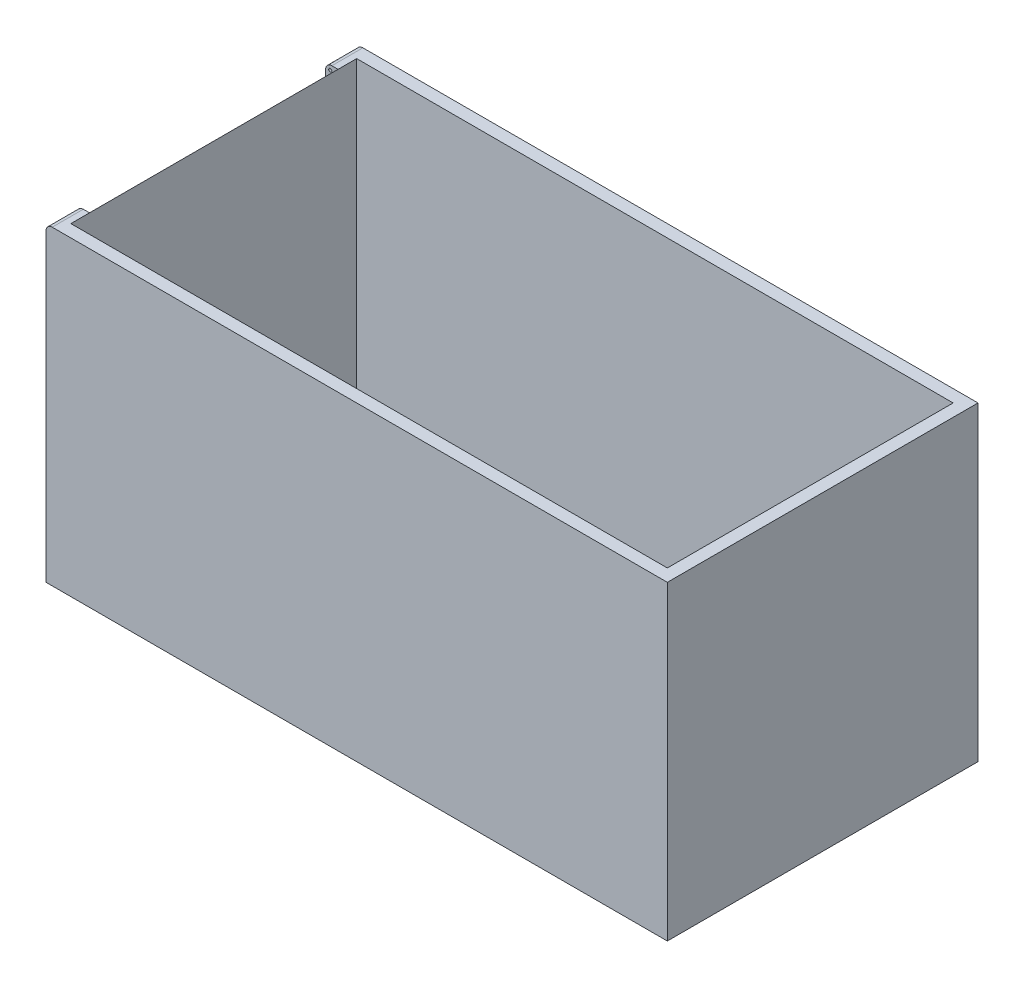
ISO-10303-21;
HEADER;
FILE_DESCRIPTION(('STEP AP214'),'2;1');
FILE_NAME('part.step','',(''),(''),'','','');
FILE_SCHEMA(('AUTOMOTIVE_DESIGN { 1 0 10303 214 1 1 1 1 }'));
ENDSEC;
DATA;
#1=APPLICATION_CONTEXT('core data for automotive mechanical design processes');
#2=APPLICATION_PROTOCOL_DEFINITION('international standard','automotive_design',2000,#1);
#3=PRODUCT_CONTEXT('',#1,'mechanical');
#4=PRODUCT('Part','Part','',(#3));
#5=PRODUCT_RELATED_PRODUCT_CATEGORY('part','',(#4));
#6=PRODUCT_DEFINITION_FORMATION('','',#4);
#7=PRODUCT_DEFINITION_CONTEXT('part definition',#1,'design');
#8=PRODUCT_DEFINITION('design','',#6,#7);
#9=PRODUCT_DEFINITION_SHAPE('','',#8);
#10=(LENGTH_UNIT() NAMED_UNIT(*) SI_UNIT(.MILLI.,.METRE.));
#11=(NAMED_UNIT(*) PLANE_ANGLE_UNIT() SI_UNIT($,.RADIAN.));
#12=(NAMED_UNIT(*) SI_UNIT($,.STERADIAN.) SOLID_ANGLE_UNIT());
#13=UNCERTAINTY_MEASURE_WITH_UNIT(LENGTH_MEASURE(1.E-05),#10,'distance_accuracy_value','');
#14=(GEOMETRIC_REPRESENTATION_CONTEXT(3) GLOBAL_UNCERTAINTY_ASSIGNED_CONTEXT((#13)) GLOBAL_UNIT_ASSIGNED_CONTEXT((#10,
#11,#12)) REPRESENTATION_CONTEXT('',''));
#15=CARTESIAN_POINT('',(0.,0.,0.));
#16=DIRECTION('',(0.,0.,1.));
#17=DIRECTION('',(1.,0.,0.));
#18=AXIS2_PLACEMENT_3D('',#15,#16,#17);
#19=CARTESIAN_POINT('',(0.,63.5,0.));
#20=DIRECTION('',(0.,-1.,0.));
#21=DIRECTION('',(0.,0.,-1.));
#22=AXIS2_PLACEMENT_3D('',#19,#20,#21);
#23=PLANE('',#22);
#24=DIRECTION('',(-1.,0.,0.));
#25=VECTOR('',#24,1.);
#26=CARTESIAN_POINT('',(-60.96,63.5,25.4));
#27=LINE('',#26,#25);
#28=CARTESIAN_POINT('',(-60.96,63.5,25.4));
#29=VERTEX_POINT('',#28);
#30=CARTESIAN_POINT('',(-62.23,63.5,25.4));
#31=VERTEX_POINT('',#30);
#32=EDGE_CURVE('E162',#29,#31,#27,.T.);
#33=ORIENTED_EDGE('',*,*,#32,.T.);
#34=DIRECTION('',(0.,0.,1.));
#35=VECTOR('',#34,1.);
#36=CARTESIAN_POINT('',(-62.23,63.5,0.));
#37=LINE('',#36,#35);
#38=CARTESIAN_POINT('',(-62.23,63.5,31.75));
#39=VERTEX_POINT('',#38);
#40=EDGE_CURVE('E253',#31,#39,#37,.T.);
#41=ORIENTED_EDGE('',*,*,#40,.T.);
#42=DIRECTION('',(1.,0.,0.));
#43=VECTOR('',#42,1.);
#44=CARTESIAN_POINT('',(-63.5,63.5,31.75));
#45=LINE('',#44,#43);
#46=CARTESIAN_POINT('',(63.5,63.5,31.75));
#47=VERTEX_POINT('',#46);
#48=EDGE_CURVE('E214',#39,#47,#45,.T.);
#49=ORIENTED_EDGE('',*,*,#48,.T.);
#50=DIRECTION('',(0.,0.,-1.));
#51=VECTOR('',#50,1.);
#52=CARTESIAN_POINT('',(63.5,63.5,31.75));
#53=LINE('',#52,#51);
#54=CARTESIAN_POINT('',(63.5,63.5,-31.75));
#55=VERTEX_POINT('',#54);
#56=EDGE_CURVE('E205',#47,#55,#53,.T.);
#57=ORIENTED_EDGE('',*,*,#56,.T.);
#58=DIRECTION('',(-1.,0.,0.));
#59=VECTOR('',#58,1.);
#60=CARTESIAN_POINT('',(-63.5,63.5,-31.75));
#61=LINE('',#60,#59);
#62=CARTESIAN_POINT('',(-62.23,63.5,-31.75));
#63=VERTEX_POINT('',#62);
#64=EDGE_CURVE('E209',#55,#63,#61,.T.);
#65=ORIENTED_EDGE('',*,*,#64,.T.);
#66=DIRECTION('',(0.,0.,1.));
#67=VECTOR('',#66,1.);
#68=CARTESIAN_POINT('',(-62.23,63.5,0.));
#69=LINE('',#68,#67);
#70=CARTESIAN_POINT('',(-62.23,63.5,-25.4));
#71=VERTEX_POINT('',#70);
#72=EDGE_CURVE('E244',#63,#71,#69,.T.);
#73=ORIENTED_EDGE('',*,*,#72,.T.);
#74=DIRECTION('',(-1.,0.,0.));
#75=VECTOR('',#74,1.);
#76=CARTESIAN_POINT('',(-60.96,63.5,-25.4));
#77=LINE('',#76,#75);
#78=CARTESIAN_POINT('',(-60.96,63.5,-25.4));
#79=VERTEX_POINT('',#78);
#80=EDGE_CURVE('E147',#79,#71,#77,.T.);
#81=ORIENTED_EDGE('',*,*,#80,.F.);
#82=DIRECTION('',(0.,0.,1.));
#83=VECTOR('',#82,1.);
#84=CARTESIAN_POINT('',(-60.96,63.5,0.));
#85=LINE('',#84,#83);
#86=CARTESIAN_POINT('',(-60.96,63.5,-29.21));
#87=VERTEX_POINT('',#86);
#88=EDGE_CURVE('E199',#87,#79,#85,.T.);
#89=ORIENTED_EDGE('',*,*,#88,.F.);
#90=DIRECTION('',(-1.,0.,0.));
#91=VECTOR('',#90,1.);
#92=CARTESIAN_POINT('',(0.,63.5,-29.21));
#93=LINE('',#92,#91);
#94=CARTESIAN_POINT('',(60.96,63.5,-29.21));
#95=VERTEX_POINT('',#94);
#96=EDGE_CURVE('E195',#95,#87,#93,.T.);
#97=ORIENTED_EDGE('',*,*,#96,.F.);
#98=DIRECTION('',(0.,0.,-1.));
#99=VECTOR('',#98,1.);
#100=CARTESIAN_POINT('',(60.96,63.5,0.));
#101=LINE('',#100,#99);
#102=CARTESIAN_POINT('',(60.96,63.5,29.21));
#103=VERTEX_POINT('',#102);
#104=EDGE_CURVE('E192',#103,#95,#101,.T.);
#105=ORIENTED_EDGE('',*,*,#104,.F.);
#106=DIRECTION('',(1.,0.,0.));
#107=VECTOR('',#106,1.);
#108=CARTESIAN_POINT('',(0.,63.5,29.21));
#109=LINE('',#108,#107);
#110=CARTESIAN_POINT('',(-60.96,63.5,29.21));
#111=VERTEX_POINT('',#110);
#112=EDGE_CURVE('E177',#111,#103,#109,.T.);
#113=ORIENTED_EDGE('',*,*,#112,.F.);
#114=EDGE_CURVE('E198',#29,#111,#85,.T.);
#115=ORIENTED_EDGE('',*,*,#114,.F.);
#116=EDGE_LOOP('',(#33,#41,#49,#57,#65,#73,#81,#89,#97,#105,#113,#115));
#117=FACE_BOUND('',#116,.T.);
#118=ADVANCED_FACE('F38',(#117),#23,.F.);
#119=CARTESIAN_POINT('',(63.5,63.5,31.75));
#120=DIRECTION('',(-1.,0.,0.));
#121=DIRECTION('',(0.,0.,1.));
#122=AXIS2_PLACEMENT_3D('',#119,#120,#121);
#123=PLANE('',#122);
#124=DIRECTION('',(0.,0.,-1.));
#125=VECTOR('',#124,1.);
#126=CARTESIAN_POINT('',(63.5,0.,31.75));
#127=LINE('',#126,#125);
#128=CARTESIAN_POINT('',(63.5,0.,31.75));
#129=VERTEX_POINT('',#128);
#130=CARTESIAN_POINT('',(63.5,0.,-31.75));
#131=VERTEX_POINT('',#130);
#132=EDGE_CURVE('E170',#129,#131,#127,.T.);
#133=ORIENTED_EDGE('',*,*,#132,.T.);
#134=DIRECTION('',(0.,-1.,0.));
#135=VECTOR('',#134,1.);
#136=CARTESIAN_POINT('',(63.5,63.5,-31.75));
#137=LINE('',#136,#135);
#138=EDGE_CURVE('E240',#55,#131,#137,.T.);
#139=ORIENTED_EDGE('',*,*,#138,.F.);
#140=ORIENTED_EDGE('',*,*,#56,.F.);
#141=DIRECTION('',(0.,-1.,0.));
#142=VECTOR('',#141,1.);
#143=CARTESIAN_POINT('',(63.5,63.5,31.75));
#144=LINE('',#143,#142);
#145=EDGE_CURVE('E217',#47,#129,#144,.T.);
#146=ORIENTED_EDGE('',*,*,#145,.T.);
#147=EDGE_LOOP('',(#133,#139,#140,#146));
#148=FACE_BOUND('',#147,.T.);
#149=ADVANCED_FACE('F319',(#148),#123,.F.);
#150=CARTESIAN_POINT('',(-63.5,63.5,-31.75));
#151=DIRECTION('',(0.,0.,1.));
#152=DIRECTION('',(1.,0.,0.));
#153=AXIS2_PLACEMENT_3D('',#150,#151,#152);
#154=PLANE('',#153);
#155=DIRECTION('',(0.,-1.,0.));
#156=VECTOR('',#155,1.);
#157=CARTESIAN_POINT('',(-63.5,63.5,-31.75));
#158=LINE('',#157,#156);
#159=CARTESIAN_POINT('',(-63.5,62.23,-31.75));
#160=VERTEX_POINT('',#159);
#161=CARTESIAN_POINT('',(-63.5,0.,-31.75));
#162=VERTEX_POINT('',#161);
#163=EDGE_CURVE('E237',#160,#162,#158,.T.);
#164=ORIENTED_EDGE('',*,*,#163,.F.);
#165=CARTESIAN_POINT('',(-62.23,62.23,-31.75));
#166=DIRECTION('',(0.,0.,1.));
#167=DIRECTION('',(1.,0.,0.));
#168=AXIS2_PLACEMENT_3D('',#165,#166,#167);
#169=CIRCLE('',#168,1.27);
#170=EDGE_CURVE('E11',#160,#63,#169,.F.);
#171=ORIENTED_EDGE('',*,*,#170,.T.);
#172=ORIENTED_EDGE('',*,*,#64,.F.);
#173=ORIENTED_EDGE('',*,*,#138,.T.);
#174=DIRECTION('',(-1.,0.,0.));
#175=VECTOR('',#174,1.);
#176=CARTESIAN_POINT('',(-63.5,0.,-31.75));
#177=LINE('',#176,#175);
#178=EDGE_CURVE('E221',#131,#162,#177,.T.);
#179=ORIENTED_EDGE('',*,*,#178,.T.);
#180=EDGE_LOOP('',(#164,#171,#172,#173,#179));
#181=FACE_BOUND('',#180,.T.);
#182=ADVANCED_FACE('F324',(#181),#154,.F.);
#183=CARTESIAN_POINT('',(-63.5,63.5,31.75));
#184=DIRECTION('',(1.,0.,0.));
#185=DIRECTION('',(0.,0.,-1.));
#186=AXIS2_PLACEMENT_3D('',#183,#184,#185);
#187=PLANE('',#186);
#188=DIRECTION('',(0.,-1.,0.));
#189=VECTOR('',#188,1.);
#190=CARTESIAN_POINT('',(-63.5,63.5,31.75));
#191=LINE('',#190,#189);
#192=CARTESIAN_POINT('',(-63.5,62.23,31.75));
#193=VERTEX_POINT('',#192);
#194=CARTESIAN_POINT('',(-63.5,0.,31.75));
#195=VERTEX_POINT('',#194);
#196=EDGE_CURVE('E234',#193,#195,#191,.T.);
#197=ORIENTED_EDGE('',*,*,#196,.F.);
#198=DIRECTION('',(0.,0.,1.));
#199=VECTOR('',#198,1.);
#200=CARTESIAN_POINT('',(-63.5,62.23,31.75));
#201=LINE('',#200,#199);
#202=CARTESIAN_POINT('',(-63.5,62.23,25.4));
#203=VERTEX_POINT('',#202);
#204=EDGE_CURVE('E262',#193,#203,#201,.F.);
#205=ORIENTED_EDGE('',*,*,#204,.T.);
#206=DIRECTION('',(0.,-1.,0.));
#207=VECTOR('',#206,1.);
#208=CARTESIAN_POINT('',(-63.5,63.5,25.4));
#209=LINE('',#208,#207);
#210=CARTESIAN_POINT('',(-63.5,60.96,25.4));
#211=VERTEX_POINT('',#210);
#212=EDGE_CURVE('E152',#203,#211,#209,.T.);
#213=ORIENTED_EDGE('',*,*,#212,.T.);
#214=DIRECTION('',(0.,0.,-1.));
#215=VECTOR('',#214,1.);
#216=CARTESIAN_POINT('',(-63.5,60.96,25.4));
#217=LINE('',#216,#215);
#218=CARTESIAN_POINT('',(-63.5,60.96,-25.4));
#219=VERTEX_POINT('',#218);
#220=EDGE_CURVE('E143',#211,#219,#217,.T.);
#221=ORIENTED_EDGE('',*,*,#220,.T.);
#222=DIRECTION('',(0.,-1.,0.));
#223=VECTOR('',#222,1.);
#224=CARTESIAN_POINT('',(-63.5,63.5,-25.4));
#225=LINE('',#224,#223);
#226=CARTESIAN_POINT('',(-63.5,62.23,-25.4));
#227=VERTEX_POINT('',#226);
#228=EDGE_CURVE('E130',#227,#219,#225,.T.);
#229=ORIENTED_EDGE('',*,*,#228,.F.);
#230=DIRECTION('',(0.,0.,1.));
#231=VECTOR('',#230,1.);
#232=CARTESIAN_POINT('',(-63.5,62.23,31.75));
#233=LINE('',#232,#231);
#234=EDGE_CURVE('E54',#227,#160,#233,.F.);
#235=ORIENTED_EDGE('',*,*,#234,.T.);
#236=ORIENTED_EDGE('',*,*,#163,.T.);
#237=DIRECTION('',(0.,0.,1.));
#238=VECTOR('',#237,1.);
#239=CARTESIAN_POINT('',(-63.5,0.,31.75));
#240=LINE('',#239,#238);
#241=EDGE_CURVE('E225',#162,#195,#240,.T.);
#242=ORIENTED_EDGE('',*,*,#241,.T.);
#243=EDGE_LOOP('',(#197,#205,#213,#221,#229,#235,#236,#242));
#244=FACE_BOUND('',#243,.T.);
#245=ADVANCED_FACE('F150',(#244),#187,.F.);
#246=CARTESIAN_POINT('',(-63.5,63.5,31.75));
#247=DIRECTION('',(0.,0.,-1.));
#248=DIRECTION('',(-1.,0.,0.));
#249=AXIS2_PLACEMENT_3D('',#246,#247,#248);
#250=PLANE('',#249);
#251=ORIENTED_EDGE('',*,*,#48,.F.);
#252=CARTESIAN_POINT('',(-62.23,62.23,31.75));
#253=DIRECTION('',(0.,0.,-1.));
#254=DIRECTION('',(-1.,0.,0.));
#255=AXIS2_PLACEMENT_3D('',#252,#253,#254);
#256=CIRCLE('',#255,1.27);
#257=EDGE_CURVE('E257',#39,#193,#256,.F.);
#258=ORIENTED_EDGE('',*,*,#257,.T.);
#259=ORIENTED_EDGE('',*,*,#196,.T.);
#260=DIRECTION('',(1.,0.,0.));
#261=VECTOR('',#260,1.);
#262=CARTESIAN_POINT('',(-63.5,0.,31.75));
#263=LINE('',#262,#261);
#264=EDGE_CURVE('E210',#195,#129,#263,.T.);
#265=ORIENTED_EDGE('',*,*,#264,.T.);
#266=ORIENTED_EDGE('',*,*,#145,.F.);
#267=EDGE_LOOP('',(#251,#258,#259,#265,#266));
#268=FACE_BOUND('',#267,.T.);
#269=ADVANCED_FACE('F310',(#268),#250,.F.);
#270=CARTESIAN_POINT('',(0.,0.,0.));
#271=DIRECTION('',(0.,-1.,0.));
#272=DIRECTION('',(0.,0.,-1.));
#273=AXIS2_PLACEMENT_3D('',#270,#271,#272);
#274=PLANE('',#273);
#275=ORIENTED_EDGE('',*,*,#132,.F.);
#276=ORIENTED_EDGE('',*,*,#264,.F.);
#277=ORIENTED_EDGE('',*,*,#241,.F.);
#278=ORIENTED_EDGE('',*,*,#178,.F.);
#279=EDGE_LOOP('',(#275,#276,#277,#278));
#280=FACE_BOUND('',#279,.T.);
#281=ADVANCED_FACE('F316',(#280),#274,.T.);
#282=CARTESIAN_POINT('',(60.96,63.5,31.75));
#283=DIRECTION('',(-1.,0.,0.));
#284=DIRECTION('',(0.,0.,1.));
#285=AXIS2_PLACEMENT_3D('',#282,#283,#284);
#286=PLANE('',#285);
#287=DIRECTION('',(0.,0.,-1.));
#288=VECTOR('',#287,1.);
#289=CARTESIAN_POINT('',(60.96,2.54,0.));
#290=LINE('',#289,#288);
#291=CARTESIAN_POINT('',(60.96,2.54,29.21));
#292=VERTEX_POINT('',#291);
#293=CARTESIAN_POINT('',(60.96,2.54,-29.21));
#294=VERTEX_POINT('',#293);
#295=EDGE_CURVE('E155',#292,#294,#290,.T.);
#296=ORIENTED_EDGE('',*,*,#295,.F.);
#297=DIRECTION('',(0.,-1.,0.));
#298=VECTOR('',#297,1.);
#299=CARTESIAN_POINT('',(60.96,63.5,29.21));
#300=LINE('',#299,#298);
#301=EDGE_CURVE('E172',#103,#292,#300,.T.);
#302=ORIENTED_EDGE('',*,*,#301,.F.);
#303=ORIENTED_EDGE('',*,*,#104,.T.);
#304=DIRECTION('',(0.,-1.,0.));
#305=VECTOR('',#304,1.);
#306=CARTESIAN_POINT('',(60.96,63.5,-29.21));
#307=LINE('',#306,#305);
#308=EDGE_CURVE('E166',#95,#294,#307,.T.);
#309=ORIENTED_EDGE('',*,*,#308,.T.);
#310=EDGE_LOOP('',(#296,#302,#303,#309));
#311=FACE_BOUND('',#310,.T.);
#312=ADVANCED_FACE('F287',(#311),#286,.T.);
#313=CARTESIAN_POINT('',(-63.5,63.5,-29.21));
#314=DIRECTION('',(0.,0.,1.));
#315=DIRECTION('',(1.,0.,0.));
#316=AXIS2_PLACEMENT_3D('',#313,#314,#315);
#317=PLANE('',#316);
#318=DIRECTION('',(-1.,0.,0.));
#319=VECTOR('',#318,1.);
#320=CARTESIAN_POINT('',(0.,2.54,-29.21));
#321=LINE('',#320,#319);
#322=CARTESIAN_POINT('',(-60.96,2.54,-29.21));
#323=VERTEX_POINT('',#322);
#324=EDGE_CURVE('E160',#294,#323,#321,.T.);
#325=ORIENTED_EDGE('',*,*,#324,.F.);
#326=ORIENTED_EDGE('',*,*,#308,.F.);
#327=ORIENTED_EDGE('',*,*,#96,.T.);
#328=DIRECTION('',(0.,-1.,0.));
#329=VECTOR('',#328,1.);
#330=CARTESIAN_POINT('',(-60.96,63.5,-29.21));
#331=LINE('',#330,#329);
#332=EDGE_CURVE('E171',#87,#323,#331,.T.);
#333=ORIENTED_EDGE('',*,*,#332,.T.);
#334=EDGE_LOOP('',(#325,#326,#327,#333));
#335=FACE_BOUND('',#334,.T.);
#336=ADVANCED_FACE('F289',(#335),#317,.T.);
#337=CARTESIAN_POINT('',(-60.96,63.5,31.75));
#338=DIRECTION('',(1.,0.,0.));
#339=DIRECTION('',(0.,0.,-1.));
#340=AXIS2_PLACEMENT_3D('',#337,#338,#339);
#341=PLANE('',#340);
#342=DIRECTION('',(0.,0.,1.));
#343=VECTOR('',#342,1.);
#344=CARTESIAN_POINT('',(-60.96,2.54,0.));
#345=LINE('',#344,#343);
#346=CARTESIAN_POINT('',(-60.96,2.54,29.21));
#347=VERTEX_POINT('',#346);
#348=EDGE_CURVE('E180',#323,#347,#345,.T.);
#349=ORIENTED_EDGE('',*,*,#348,.F.);
#350=ORIENTED_EDGE('',*,*,#332,.F.);
#351=ORIENTED_EDGE('',*,*,#88,.T.);
#352=DIRECTION('',(0.,0.,-1.));
#353=VECTOR('',#352,1.);
#354=CARTESIAN_POINT('',(-60.96,63.5,25.4));
#355=LINE('',#354,#353);
#356=EDGE_CURVE('E145',#29,#79,#355,.T.);
#357=ORIENTED_EDGE('',*,*,#356,.F.);
#358=ORIENTED_EDGE('',*,*,#114,.T.);
#359=DIRECTION('',(0.,-1.,0.));
#360=VECTOR('',#359,1.);
#361=CARTESIAN_POINT('',(-60.96,63.5,29.21));
#362=LINE('',#361,#360);
#363=EDGE_CURVE('E176',#111,#347,#362,.T.);
#364=ORIENTED_EDGE('',*,*,#363,.T.);
#365=EDGE_LOOP('',(#349,#350,#351,#357,#358,#364));
#366=FACE_BOUND('',#365,.T.);
#367=ADVANCED_FACE('F273',(#366),#341,.T.);
#368=CARTESIAN_POINT('',(-63.5,63.5,29.21));
#369=DIRECTION('',(0.,0.,-1.));
#370=DIRECTION('',(-1.,0.,0.));
#371=AXIS2_PLACEMENT_3D('',#368,#369,#370);
#372=PLANE('',#371);
#373=DIRECTION('',(1.,0.,0.));
#374=VECTOR('',#373,1.);
#375=CARTESIAN_POINT('',(0.,2.54,29.21));
#376=LINE('',#375,#374);
#377=EDGE_CURVE('E186',#347,#292,#376,.T.);
#378=ORIENTED_EDGE('',*,*,#377,.F.);
#379=ORIENTED_EDGE('',*,*,#363,.F.);
#380=ORIENTED_EDGE('',*,*,#112,.T.);
#381=ORIENTED_EDGE('',*,*,#301,.T.);
#382=EDGE_LOOP('',(#378,#379,#380,#381));
#383=FACE_BOUND('',#382,.T.);
#384=ADVANCED_FACE('F279',(#383),#372,.T.);
#385=CARTESIAN_POINT('',(0.,2.54,0.));
#386=DIRECTION('',(0.,-1.,0.));
#387=DIRECTION('',(0.,0.,-1.));
#388=AXIS2_PLACEMENT_3D('',#385,#386,#387);
#389=PLANE('',#388);
#390=ORIENTED_EDGE('',*,*,#295,.T.);
#391=ORIENTED_EDGE('',*,*,#324,.T.);
#392=ORIENTED_EDGE('',*,*,#348,.T.);
#393=ORIENTED_EDGE('',*,*,#377,.T.);
#394=EDGE_LOOP('',(#390,#391,#392,#393));
#395=FACE_BOUND('',#394,.T.);
#396=ADVANCED_FACE('F292',(#395),#389,.F.);
#397=CARTESIAN_POINT('',(-63.5,63.5,25.4));
#398=DIRECTION('',(0.,0.,-1.));
#399=DIRECTION('',(-1.,0.,0.));
#400=AXIS2_PLACEMENT_3D('',#397,#398,#399);
#401=CYLINDRICAL_SURFACE('',#400,2.54);
#402=ORIENTED_EDGE('',*,*,#220,.F.);
#403=CARTESIAN_POINT('',(-63.5,63.5,25.4));
#404=DIRECTION('',(0.,0.,1.));
#405=DIRECTION('',(1.,0.,0.));
#406=AXIS2_PLACEMENT_3D('',#403,#404,#405);
#407=CIRCLE('',#406,2.54);
#408=EDGE_CURVE('E297',#211,#29,#407,.T.);
#409=ORIENTED_EDGE('',*,*,#408,.T.);
#410=ORIENTED_EDGE('',*,*,#356,.T.);
#411=CARTESIAN_POINT('',(-63.5,63.5,-25.4));
#412=DIRECTION('',(0.,0.,1.));
#413=DIRECTION('',(1.,0.,0.));
#414=AXIS2_PLACEMENT_3D('',#411,#412,#413);
#415=CIRCLE('',#414,2.54);
#416=EDGE_CURVE('E133',#219,#79,#415,.T.);
#417=ORIENTED_EDGE('',*,*,#416,.F.);
#418=EDGE_LOOP('',(#402,#409,#410,#417));
#419=FACE_BOUND('',#418,.T.);
#420=ADVANCED_FACE('F141',(#419),#401,.F.);
#421=CARTESIAN_POINT('',(-63.5,63.5,25.4));
#422=DIRECTION('',(0.,0.,1.));
#423=DIRECTION('',(1.,0.,0.));
#424=AXIS2_PLACEMENT_3D('',#421,#422,#423);
#425=PLANE('',#424);
#426=CARTESIAN_POINT('',(-62.5475,62.5475,25.4));
#427=DIRECTION('',(0.,0.,1.));
#428=DIRECTION('',(1.,0.,0.));
#429=AXIS2_PLACEMENT_3D('',#426,#427,#428);
#430=CIRCLE('',#429,0.317499999999999);
#431=CARTESIAN_POINT('',(-62.23,62.5475,25.4));
#432=VERTEX_POINT('',#431);
#433=EDGE_CURVE('E137',#432,#432,#430,.F.);
#434=ORIENTED_EDGE('',*,*,#433,.F.);
#435=EDGE_LOOP('',(#434));
#436=FACE_BOUND('',#435,.T.);
#437=ORIENTED_EDGE('',*,*,#212,.F.);
#438=CARTESIAN_POINT('',(-62.23,62.23,25.4));
#439=DIRECTION('',(0.,0.,1.));
#440=DIRECTION('',(1.,0.,0.));
#441=AXIS2_PLACEMENT_3D('',#438,#439,#440);
#442=CIRCLE('',#441,1.27);
#443=EDGE_CURVE('E265',#203,#31,#442,.F.);
#444=ORIENTED_EDGE('',*,*,#443,.T.);
#445=ORIENTED_EDGE('',*,*,#32,.F.);
#446=ORIENTED_EDGE('',*,*,#408,.F.);
#447=EDGE_LOOP('',(#437,#444,#445,#446));
#448=FACE_BOUND('',#447,.T.);
#449=ADVANCED_FACE('F351',(#436,#448),#425,.F.);
#450=CARTESIAN_POINT('',(-63.5,63.5,-25.4));
#451=DIRECTION('',(0.,0.,1.));
#452=DIRECTION('',(1.,0.,0.));
#453=AXIS2_PLACEMENT_3D('',#450,#451,#452);
#454=PLANE('',#453);
#455=CARTESIAN_POINT('',(-62.5475,62.5475,-25.4));
#456=DIRECTION('',(0.,0.,1.));
#457=DIRECTION('',(1.,0.,0.));
#458=AXIS2_PLACEMENT_3D('',#455,#456,#457);
#459=CIRCLE('',#458,0.317499999999999);
#460=CARTESIAN_POINT('',(-62.23,62.5475,-25.4));
#461=VERTEX_POINT('',#460);
#462=EDGE_CURVE('E245',#461,#461,#459,.F.);
#463=ORIENTED_EDGE('',*,*,#462,.T.);
#464=EDGE_LOOP('',(#463));
#465=FACE_BOUND('',#464,.T.);
#466=ORIENTED_EDGE('',*,*,#80,.T.);
#467=CARTESIAN_POINT('',(-62.23,62.23,-25.4));
#468=DIRECTION('',(0.,0.,1.));
#469=DIRECTION('',(1.,0.,0.));
#470=AXIS2_PLACEMENT_3D('',#467,#468,#469);
#471=CIRCLE('',#470,1.27);
#472=EDGE_CURVE('E47',#71,#227,#471,.T.);
#473=ORIENTED_EDGE('',*,*,#472,.T.);
#474=ORIENTED_EDGE('',*,*,#228,.T.);
#475=ORIENTED_EDGE('',*,*,#416,.T.);
#476=EDGE_LOOP('',(#466,#473,#474,#475));
#477=FACE_BOUND('',#476,.T.);
#478=ADVANCED_FACE('F132',(#465,#477),#454,.T.);
#479=CARTESIAN_POINT('',(0.,0.,-26.67));
#480=DIRECTION('',(0.,0.,1.));
#481=DIRECTION('',(1.,0.,0.));
#482=AXIS2_PLACEMENT_3D('',#479,#480,#481);
#483=PLANE('',#482);
#484=CARTESIAN_POINT('',(-62.5475,62.5475,-26.67));
#485=DIRECTION('',(0.,0.,1.));
#486=DIRECTION('',(1.,0.,0.));
#487=AXIS2_PLACEMENT_3D('',#484,#485,#486);
#488=CIRCLE('',#487,0.317499999999999);
#489=CARTESIAN_POINT('',(-62.23,62.5475,-26.67));
#490=VERTEX_POINT('',#489);
#491=EDGE_CURVE('E495',#490,#490,#488,.T.);
#492=ORIENTED_EDGE('',*,*,#491,.T.);
#493=EDGE_LOOP('',(#492));
#494=FACE_BOUND('',#493,.T.);
#495=ADVANCED_FACE('F363',(#494),#483,.T.);
#496=CARTESIAN_POINT('',(-62.5475,62.5475,26.67));
#497=DIRECTION('',(0.,0.,-1.));
#498=DIRECTION('',(-1.,0.,0.));
#499=AXIS2_PLACEMENT_3D('',#496,#497,#498);
#500=CYLINDRICAL_SURFACE('',#499,0.317499999999999);
#501=ORIENTED_EDGE('',*,*,#462,.F.);
#502=EDGE_LOOP('',(#501));
#503=FACE_BOUND('',#502,.T.);
#504=ORIENTED_EDGE('',*,*,#491,.F.);
#505=EDGE_LOOP('',(#504));
#506=FACE_BOUND('',#505,.T.);
#507=ADVANCED_FACE('F394',(#503,#506),#500,.F.);
#508=CARTESIAN_POINT('',(-62.5475,62.5475,26.67));
#509=DIRECTION('',(0.,0.,1.));
#510=DIRECTION('',(1.,0.,0.));
#511=AXIS2_PLACEMENT_3D('',#508,#509,#510);
#512=CIRCLE('',#511,0.317499999999999);
#513=CARTESIAN_POINT('',(-62.23,62.5475,26.67));
#514=VERTEX_POINT('',#513);
#515=EDGE_CURVE('E249',#514,#514,#512,.T.);
#516=ORIENTED_EDGE('',*,*,#515,.T.);
#517=EDGE_LOOP('',(#516));
#518=FACE_BOUND('',#517,.T.);
#519=ORIENTED_EDGE('',*,*,#433,.T.);
#520=EDGE_LOOP('',(#519));
#521=FACE_BOUND('',#520,.T.);
#522=ADVANCED_FACE('F387',(#518,#521),#500,.F.);
#523=CARTESIAN_POINT('',(0.,0.,26.67));
#524=DIRECTION('',(0.,0.,1.));
#525=DIRECTION('',(1.,0.,0.));
#526=AXIS2_PLACEMENT_3D('',#523,#524,#525);
#527=PLANE('',#526);
#528=ORIENTED_EDGE('',*,*,#515,.F.);
#529=EDGE_LOOP('',(#528));
#530=FACE_BOUND('',#529,.T.);
#531=ADVANCED_FACE('F373',(#530),#527,.F.);
#532=CARTESIAN_POINT('',(-62.23,62.23,0.));
#533=DIRECTION('',(0.,0.,1.));
#534=DIRECTION('',(1.,0.,0.));
#535=AXIS2_PLACEMENT_3D('',#532,#533,#534);
#536=CYLINDRICAL_SURFACE('',#535,1.27);
#537=ORIENTED_EDGE('',*,*,#443,.F.);
#538=ORIENTED_EDGE('',*,*,#204,.F.);
#539=ORIENTED_EDGE('',*,*,#257,.F.);
#540=ORIENTED_EDGE('',*,*,#40,.F.);
#541=EDGE_LOOP('',(#537,#538,#539,#540));
#542=FACE_BOUND('',#541,.T.);
#543=ADVANCED_FACE('F307',(#542),#536,.T.);
#544=CARTESIAN_POINT('',(-62.23,62.23,0.));
#545=DIRECTION('',(0.,0.,1.));
#546=DIRECTION('',(1.,0.,0.));
#547=AXIS2_PLACEMENT_3D('',#544,#545,#546);
#548=CYLINDRICAL_SURFACE('',#547,1.27);
#549=ORIENTED_EDGE('',*,*,#170,.F.);
#550=ORIENTED_EDGE('',*,*,#234,.F.);
#551=ORIENTED_EDGE('',*,*,#472,.F.);
#552=ORIENTED_EDGE('',*,*,#72,.F.);
#553=EDGE_LOOP('',(#549,#550,#551,#552));
#554=FACE_BOUND('',#553,.T.);
#555=ADVANCED_FACE('F40',(#554),#548,.T.);
#556=CLOSED_SHELL('',(#118,#149,#182,#245,#269,#281,#312,#336,#367,#384,#396,#420,#449,#478,
#495,#507,#522,#531,#543,#555));
#557=MANIFOLD_SOLID_BREP('B2',#556);
#558=ADVANCED_BREP_SHAPE_REPRESENTATION('',(#18,#557),#14);
#559=SHAPE_DEFINITION_REPRESENTATION(#9,#558);
ENDSEC;
END-ISO-10303-21;
